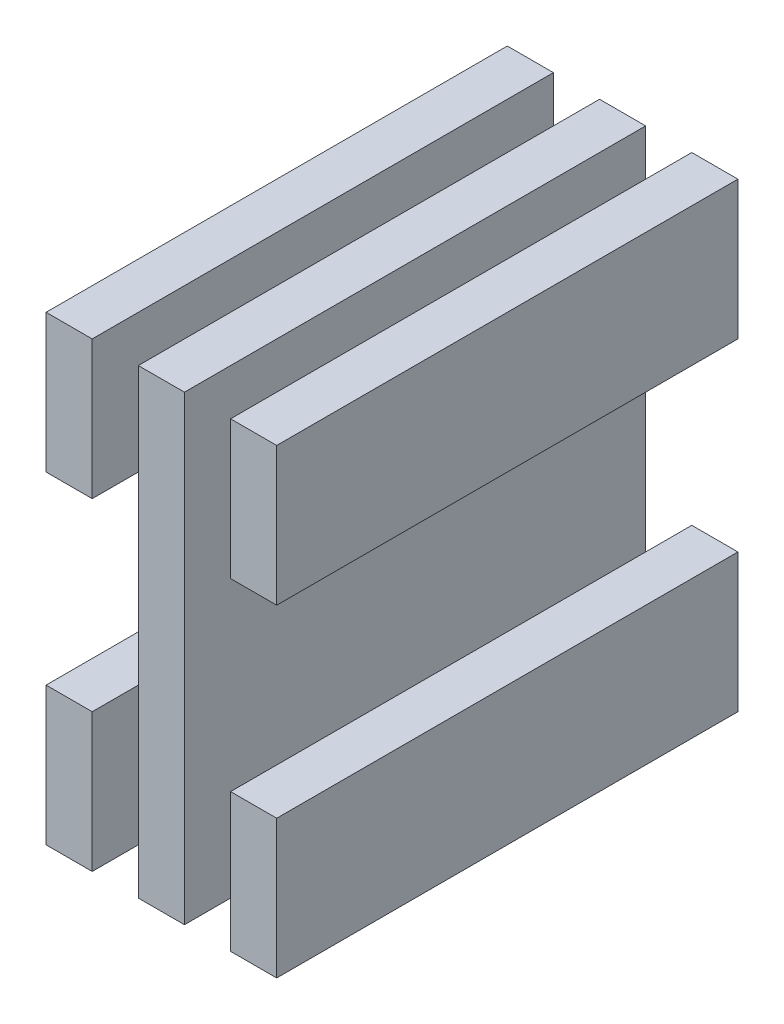
ISO-10303-21;
HEADER;
FILE_DESCRIPTION(('STEP AP214'),'2;1');
FILE_NAME('part.step','',(''),(''),'','','');
FILE_SCHEMA(('AUTOMOTIVE_DESIGN { 1 0 10303 214 1 1 1 1 }'));
ENDSEC;
DATA;
#1=APPLICATION_CONTEXT('core data for automotive mechanical design processes');
#2=APPLICATION_PROTOCOL_DEFINITION('international standard','automotive_design',2000,#1);
#3=PRODUCT_CONTEXT('',#1,'mechanical');
#4=PRODUCT('Part','Part','',(#3));
#5=PRODUCT_RELATED_PRODUCT_CATEGORY('part','',(#4));
#6=PRODUCT_DEFINITION_FORMATION('','',#4);
#7=PRODUCT_DEFINITION_CONTEXT('part definition',#1,'design');
#8=PRODUCT_DEFINITION('design','',#6,#7);
#9=PRODUCT_DEFINITION_SHAPE('','',#8);
#10=(LENGTH_UNIT() NAMED_UNIT(*) SI_UNIT(.MILLI.,.METRE.));
#11=(NAMED_UNIT(*) PLANE_ANGLE_UNIT() SI_UNIT($,.RADIAN.));
#12=(NAMED_UNIT(*) SI_UNIT($,.STERADIAN.) SOLID_ANGLE_UNIT());
#13=UNCERTAINTY_MEASURE_WITH_UNIT(LENGTH_MEASURE(1.E-05),#10,'distance_accuracy_value','');
#14=(GEOMETRIC_REPRESENTATION_CONTEXT(3) GLOBAL_UNCERTAINTY_ASSIGNED_CONTEXT((#13)) GLOBAL_UNIT_ASSIGNED_CONTEXT((#10,
#11,#12)) REPRESENTATION_CONTEXT('',''));
#15=CARTESIAN_POINT('',(0.,0.,0.));
#16=DIRECTION('',(0.,0.,1.));
#17=DIRECTION('',(1.,0.,0.));
#18=AXIS2_PLACEMENT_3D('',#15,#16,#17);
#19=CARTESIAN_POINT('',(0.,50.,0.));
#20=DIRECTION('',(1.,0.,0.));
#21=DIRECTION('',(0.,0.,-1.));
#22=AXIS2_PLACEMENT_3D('',#19,#20,#21);
#23=PLANE('',#22);
#24=DIRECTION('',(0.,-1.,0.));
#25=VECTOR('',#24,1.);
#26=CARTESIAN_POINT('',(0.,50.,-50.));
#27=LINE('',#26,#25);
#28=CARTESIAN_POINT('',(0.,50.,-50.));
#29=VERTEX_POINT('',#28);
#30=CARTESIAN_POINT('',(0.,35.,-50.));
#31=VERTEX_POINT('',#30);
#32=EDGE_CURVE('E47',#29,#31,#27,.T.);
#33=ORIENTED_EDGE('',*,*,#32,.T.);
#34=DIRECTION('',(0.,0.,1.));
#35=VECTOR('',#34,1.);
#36=CARTESIAN_POINT('',(0.,35.,0.));
#37=LINE('',#36,#35);
#38=CARTESIAN_POINT('',(0.,35.,0.));
#39=VERTEX_POINT('',#38);
#40=EDGE_CURVE('E79',#31,#39,#37,.T.);
#41=ORIENTED_EDGE('',*,*,#40,.T.);
#42=DIRECTION('',(0.,-1.,0.));
#43=VECTOR('',#42,1.);
#44=CARTESIAN_POINT('',(0.,50.,0.));
#45=LINE('',#44,#43);
#46=CARTESIAN_POINT('',(0.,50.,0.));
#47=VERTEX_POINT('',#46);
#48=EDGE_CURVE('E88',#47,#39,#45,.T.);
#49=ORIENTED_EDGE('',*,*,#48,.F.);
#50=DIRECTION('',(0.,0.,1.));
#51=VECTOR('',#50,1.);
#52=CARTESIAN_POINT('',(0.,50.,0.));
#53=LINE('',#52,#51);
#54=EDGE_CURVE('E103',#29,#47,#53,.T.);
#55=ORIENTED_EDGE('',*,*,#54,.F.);
#56=EDGE_LOOP('',(#33,#41,#49,#55));
#57=FACE_BOUND('',#56,.T.);
#58=ADVANCED_FACE('F44',(#57),#23,.F.);
#59=CARTESIAN_POINT('',(0.,50.,0.));
#60=DIRECTION('',(0.,0.,-1.));
#61=DIRECTION('',(-1.,0.,0.));
#62=AXIS2_PLACEMENT_3D('',#59,#60,#61);
#63=PLANE('',#62);
#64=ORIENTED_EDGE('',*,*,#48,.T.);
#65=DIRECTION('',(1.,0.,0.));
#66=VECTOR('',#65,1.);
#67=CARTESIAN_POINT('',(0.,35.,0.));
#68=LINE('',#67,#66);
#69=CARTESIAN_POINT('',(5.,35.,0.));
#70=VERTEX_POINT('',#69);
#71=EDGE_CURVE('E81',#39,#70,#68,.T.);
#72=ORIENTED_EDGE('',*,*,#71,.T.);
#73=DIRECTION('',(0.,-1.,0.));
#74=VECTOR('',#73,1.);
#75=CARTESIAN_POINT('',(5.,50.,0.));
#76=LINE('',#75,#74);
#77=CARTESIAN_POINT('',(5.,50.,0.));
#78=VERTEX_POINT('',#77);
#79=EDGE_CURVE('E87',#78,#70,#76,.T.);
#80=ORIENTED_EDGE('',*,*,#79,.F.);
#81=DIRECTION('',(1.,0.,0.));
#82=VECTOR('',#81,1.);
#83=CARTESIAN_POINT('',(0.,50.,0.));
#84=LINE('',#83,#82);
#85=EDGE_CURVE('E97',#47,#78,#84,.T.);
#86=ORIENTED_EDGE('',*,*,#85,.F.);
#87=EDGE_LOOP('',(#64,#72,#80,#86));
#88=FACE_BOUND('',#87,.T.);
#89=ADVANCED_FACE('F96',(#88),#63,.F.);
#90=CARTESIAN_POINT('',(5.,50.,0.));
#91=DIRECTION('',(-1.,0.,0.));
#92=DIRECTION('',(0.,0.,1.));
#93=AXIS2_PLACEMENT_3D('',#90,#91,#92);
#94=PLANE('',#93);
#95=ORIENTED_EDGE('',*,*,#79,.T.);
#96=DIRECTION('',(0.,0.,-1.));
#97=VECTOR('',#96,1.);
#98=CARTESIAN_POINT('',(5.,35.,0.));
#99=LINE('',#98,#97);
#100=CARTESIAN_POINT('',(5.,35.,-50.));
#101=VERTEX_POINT('',#100);
#102=EDGE_CURVE('E61',#70,#101,#99,.T.);
#103=ORIENTED_EDGE('',*,*,#102,.T.);
#104=DIRECTION('',(0.,-1.,0.));
#105=VECTOR('',#104,1.);
#106=CARTESIAN_POINT('',(5.,50.,-50.));
#107=LINE('',#106,#105);
#108=CARTESIAN_POINT('',(5.,50.,-50.));
#109=VERTEX_POINT('',#108);
#110=EDGE_CURVE('E101',#109,#101,#107,.T.);
#111=ORIENTED_EDGE('',*,*,#110,.F.);
#112=DIRECTION('',(0.,0.,-1.));
#113=VECTOR('',#112,1.);
#114=CARTESIAN_POINT('',(5.,50.,0.));
#115=LINE('',#114,#113);
#116=EDGE_CURVE('E112',#78,#109,#115,.T.);
#117=ORIENTED_EDGE('',*,*,#116,.F.);
#118=EDGE_LOOP('',(#95,#103,#111,#117));
#119=FACE_BOUND('',#118,.T.);
#120=ADVANCED_FACE('F119',(#119),#94,.F.);
#121=CARTESIAN_POINT('',(0.,50.,-50.));
#122=DIRECTION('',(0.,0.,1.));
#123=DIRECTION('',(1.,0.,0.));
#124=AXIS2_PLACEMENT_3D('',#121,#122,#123);
#125=PLANE('',#124);
#126=ORIENTED_EDGE('',*,*,#110,.T.);
#127=DIRECTION('',(1.,0.,0.));
#128=VECTOR('',#127,1.);
#129=CARTESIAN_POINT('',(0.,35.,-50.));
#130=LINE('',#129,#128);
#131=EDGE_CURVE('E12',#31,#101,#130,.T.);
#132=ORIENTED_EDGE('',*,*,#131,.F.);
#133=ORIENTED_EDGE('',*,*,#32,.F.);
#134=DIRECTION('',(-1.,0.,0.));
#135=VECTOR('',#134,1.);
#136=CARTESIAN_POINT('',(0.,50.,-50.));
#137=LINE('',#136,#135);
#138=EDGE_CURVE('E53',#109,#29,#137,.T.);
#139=ORIENTED_EDGE('',*,*,#138,.F.);
#140=EDGE_LOOP('',(#126,#132,#133,#139));
#141=FACE_BOUND('',#140,.T.);
#142=ADVANCED_FACE('F117',(#141),#125,.F.);
#143=CARTESIAN_POINT('',(0.,50.,0.));
#144=DIRECTION('',(0.,-1.,0.));
#145=DIRECTION('',(0.,0.,-1.));
#146=AXIS2_PLACEMENT_3D('',#143,#144,#145);
#147=PLANE('',#146);
#148=ORIENTED_EDGE('',*,*,#54,.T.);
#149=ORIENTED_EDGE('',*,*,#85,.T.);
#150=ORIENTED_EDGE('',*,*,#116,.T.);
#151=ORIENTED_EDGE('',*,*,#138,.T.);
#152=EDGE_LOOP('',(#148,#149,#150,#151));
#153=FACE_BOUND('',#152,.T.);
#154=ADVANCED_FACE('F115',(#153),#147,.F.);
#155=CARTESIAN_POINT('',(0.,35.,0.));
#156=DIRECTION('',(0.,1.,0.));
#157=DIRECTION('',(0.,0.,1.));
#158=AXIS2_PLACEMENT_3D('',#155,#156,#157);
#159=PLANE('',#158);
#160=ORIENTED_EDGE('',*,*,#71,.F.);
#161=ORIENTED_EDGE('',*,*,#40,.F.);
#162=ORIENTED_EDGE('',*,*,#131,.T.);
#163=ORIENTED_EDGE('',*,*,#102,.F.);
#164=EDGE_LOOP('',(#160,#161,#162,#163));
#165=FACE_BOUND('',#164,.T.);
#166=ADVANCED_FACE('F82',(#165),#159,.F.);
#167=CLOSED_SHELL('',(#58,#89,#120,#142,#154,#166));
#168=MANIFOLD_SOLID_BREP('B2',#167);
#169=CARTESIAN_POINT('',(20.,50.,0.));
#170=DIRECTION('',(0.,0.,-1.));
#171=DIRECTION('',(-1.,0.,0.));
#172=AXIS2_PLACEMENT_3D('',#169,#170,#171);
#173=PLANE('',#172);
#174=DIRECTION('',(0.,-1.,0.));
#175=VECTOR('',#174,1.);
#176=CARTESIAN_POINT('',(20.,50.,0.));
#177=LINE('',#176,#175);
#178=CARTESIAN_POINT('',(20.,50.,0.));
#179=VERTEX_POINT('',#178);
#180=CARTESIAN_POINT('',(20.,35.,0.));
#181=VERTEX_POINT('',#180);
#182=EDGE_CURVE('E181',#179,#181,#177,.T.);
#183=ORIENTED_EDGE('',*,*,#182,.T.);
#184=DIRECTION('',(1.,0.,0.));
#185=VECTOR('',#184,1.);
#186=CARTESIAN_POINT('',(0.,35.,0.));
#187=LINE('',#186,#185);
#188=CARTESIAN_POINT('',(25.,35.,0.));
#189=VERTEX_POINT('',#188);
#190=EDGE_CURVE('E237',#181,#189,#187,.T.);
#191=ORIENTED_EDGE('',*,*,#190,.T.);
#192=DIRECTION('',(0.,-1.,0.));
#193=VECTOR('',#192,1.);
#194=CARTESIAN_POINT('',(25.,50.,0.));
#195=LINE('',#194,#193);
#196=CARTESIAN_POINT('',(25.,50.,0.));
#197=VERTEX_POINT('',#196);
#198=EDGE_CURVE('E225',#197,#189,#195,.T.);
#199=ORIENTED_EDGE('',*,*,#198,.F.);
#200=DIRECTION('',(1.,0.,0.));
#201=VECTOR('',#200,1.);
#202=CARTESIAN_POINT('',(20.,50.,0.));
#203=LINE('',#202,#201);
#204=EDGE_CURVE('E230',#179,#197,#203,.T.);
#205=ORIENTED_EDGE('',*,*,#204,.F.);
#206=EDGE_LOOP('',(#183,#191,#199,#205));
#207=FACE_BOUND('',#206,.T.);
#208=ADVANCED_FACE('F178',(#207),#173,.F.);
#209=CARTESIAN_POINT('',(25.,50.,0.));
#210=DIRECTION('',(-1.,0.,0.));
#211=DIRECTION('',(0.,0.,1.));
#212=AXIS2_PLACEMENT_3D('',#209,#210,#211);
#213=PLANE('',#212);
#214=ORIENTED_EDGE('',*,*,#198,.T.);
#215=DIRECTION('',(0.,0.,1.));
#216=VECTOR('',#215,1.);
#217=CARTESIAN_POINT('',(25.,35.,0.));
#218=LINE('',#217,#216);
#219=CARTESIAN_POINT('',(25.,35.,-50.));
#220=VERTEX_POINT('',#219);
#221=EDGE_CURVE('E42',#220,#189,#218,.T.);
#222=ORIENTED_EDGE('',*,*,#221,.F.);
#223=DIRECTION('',(0.,-1.,0.));
#224=VECTOR('',#223,1.);
#225=CARTESIAN_POINT('',(25.,50.,-50.));
#226=LINE('',#225,#224);
#227=CARTESIAN_POINT('',(25.,50.,-50.));
#228=VERTEX_POINT('',#227);
#229=EDGE_CURVE('E227',#228,#220,#226,.T.);
#230=ORIENTED_EDGE('',*,*,#229,.F.);
#231=DIRECTION('',(0.,0.,-1.));
#232=VECTOR('',#231,1.);
#233=CARTESIAN_POINT('',(25.,50.,0.));
#234=LINE('',#233,#232);
#235=EDGE_CURVE('E219',#197,#228,#234,.T.);
#236=ORIENTED_EDGE('',*,*,#235,.F.);
#237=EDGE_LOOP('',(#214,#222,#230,#236));
#238=FACE_BOUND('',#237,.T.);
#239=ADVANCED_FACE('F223',(#238),#213,.F.);
#240=CARTESIAN_POINT('',(20.,50.,-50.));
#241=DIRECTION('',(0.,0.,1.));
#242=DIRECTION('',(1.,0.,0.));
#243=AXIS2_PLACEMENT_3D('',#240,#241,#242);
#244=PLANE('',#243);
#245=ORIENTED_EDGE('',*,*,#229,.T.);
#246=DIRECTION('',(1.,0.,0.));
#247=VECTOR('',#246,1.);
#248=CARTESIAN_POINT('',(0.,35.,-50.));
#249=LINE('',#248,#247);
#250=CARTESIAN_POINT('',(20.,35.,-50.));
#251=VERTEX_POINT('',#250);
#252=EDGE_CURVE('E187',#251,#220,#249,.T.);
#253=ORIENTED_EDGE('',*,*,#252,.F.);
#254=DIRECTION('',(0.,-1.,0.));
#255=VECTOR('',#254,1.);
#256=CARTESIAN_POINT('',(20.,50.,-50.));
#257=LINE('',#256,#255);
#258=CARTESIAN_POINT('',(20.,50.,-50.));
#259=VERTEX_POINT('',#258);
#260=EDGE_CURVE('E239',#259,#251,#257,.T.);
#261=ORIENTED_EDGE('',*,*,#260,.F.);
#262=DIRECTION('',(-1.,0.,0.));
#263=VECTOR('',#262,1.);
#264=CARTESIAN_POINT('',(20.,50.,-50.));
#265=LINE('',#264,#263);
#266=EDGE_CURVE('E229',#228,#259,#265,.T.);
#267=ORIENTED_EDGE('',*,*,#266,.F.);
#268=EDGE_LOOP('',(#245,#253,#261,#267));
#269=FACE_BOUND('',#268,.T.);
#270=ADVANCED_FACE('F250',(#269),#244,.F.);
#271=CARTESIAN_POINT('',(20.,50.,0.));
#272=DIRECTION('',(1.,0.,0.));
#273=DIRECTION('',(0.,0.,-1.));
#274=AXIS2_PLACEMENT_3D('',#271,#272,#273);
#275=PLANE('',#274);
#276=ORIENTED_EDGE('',*,*,#260,.T.);
#277=DIRECTION('',(0.,0.,1.));
#278=VECTOR('',#277,1.);
#279=CARTESIAN_POINT('',(20.,35.,0.));
#280=LINE('',#279,#278);
#281=EDGE_CURVE('E196',#251,#181,#280,.T.);
#282=ORIENTED_EDGE('',*,*,#281,.T.);
#283=ORIENTED_EDGE('',*,*,#182,.F.);
#284=DIRECTION('',(0.,0.,1.));
#285=VECTOR('',#284,1.);
#286=CARTESIAN_POINT('',(20.,50.,0.));
#287=LINE('',#286,#285);
#288=EDGE_CURVE('E213',#259,#179,#287,.T.);
#289=ORIENTED_EDGE('',*,*,#288,.F.);
#290=EDGE_LOOP('',(#276,#282,#283,#289));
#291=FACE_BOUND('',#290,.T.);
#292=ADVANCED_FACE('F251',(#291),#275,.F.);
#293=CARTESIAN_POINT('',(0.,50.,0.));
#294=DIRECTION('',(0.,1.,0.));
#295=DIRECTION('',(0.,0.,1.));
#296=AXIS2_PLACEMENT_3D('',#293,#294,#295);
#297=PLANE('',#296);
#298=ORIENTED_EDGE('',*,*,#204,.T.);
#299=ORIENTED_EDGE('',*,*,#235,.T.);
#300=ORIENTED_EDGE('',*,*,#266,.T.);
#301=ORIENTED_EDGE('',*,*,#288,.T.);
#302=EDGE_LOOP('',(#298,#299,#300,#301));
#303=FACE_BOUND('',#302,.T.);
#304=ADVANCED_FACE('F233',(#303),#297,.T.);
#305=CARTESIAN_POINT('',(0.,35.,0.));
#306=DIRECTION('',(0.,1.,0.));
#307=DIRECTION('',(0.,0.,1.));
#308=AXIS2_PLACEMENT_3D('',#305,#306,#307);
#309=PLANE('',#308);
#310=ORIENTED_EDGE('',*,*,#252,.T.);
#311=ORIENTED_EDGE('',*,*,#221,.T.);
#312=ORIENTED_EDGE('',*,*,#190,.F.);
#313=ORIENTED_EDGE('',*,*,#281,.F.);
#314=EDGE_LOOP('',(#310,#311,#312,#313));
#315=FACE_BOUND('',#314,.T.);
#316=ADVANCED_FACE('F258',(#315),#309,.F.);
#317=CLOSED_SHELL('',(#208,#239,#270,#292,#304,#316));
#318=MANIFOLD_SOLID_BREP('B6',#317);
#319=CARTESIAN_POINT('',(0.,0.,0.));
#320=DIRECTION('',(0.,1.,0.));
#321=DIRECTION('',(0.,0.,1.));
#322=AXIS2_PLACEMENT_3D('',#319,#320,#321);
#323=PLANE('',#322);
#324=DIRECTION('',(1.,0.,0.));
#325=VECTOR('',#324,1.);
#326=CARTESIAN_POINT('',(20.,0.,0.));
#327=LINE('',#326,#325);
#328=CARTESIAN_POINT('',(20.,0.,0.));
#329=VERTEX_POINT('',#328);
#330=CARTESIAN_POINT('',(25.,0.,0.));
#331=VERTEX_POINT('',#330);
#332=EDGE_CURVE('E365',#329,#331,#327,.T.);
#333=ORIENTED_EDGE('',*,*,#332,.F.);
#334=DIRECTION('',(0.,0.,1.));
#335=VECTOR('',#334,1.);
#336=CARTESIAN_POINT('',(20.,0.,0.));
#337=LINE('',#336,#335);
#338=CARTESIAN_POINT('',(20.,0.,-50.));
#339=VERTEX_POINT('',#338);
#340=EDGE_CURVE('E371',#339,#329,#337,.T.);
#341=ORIENTED_EDGE('',*,*,#340,.F.);
#342=DIRECTION('',(-1.,0.,0.));
#343=VECTOR('',#342,1.);
#344=CARTESIAN_POINT('',(20.,0.,-50.));
#345=LINE('',#344,#343);
#346=CARTESIAN_POINT('',(25.,0.,-50.));
#347=VERTEX_POINT('',#346);
#348=EDGE_CURVE('E373',#347,#339,#345,.T.);
#349=ORIENTED_EDGE('',*,*,#348,.F.);
#350=DIRECTION('',(0.,0.,-1.));
#351=VECTOR('',#350,1.);
#352=CARTESIAN_POINT('',(25.,0.,0.));
#353=LINE('',#352,#351);
#354=EDGE_CURVE('E376',#331,#347,#353,.T.);
#355=ORIENTED_EDGE('',*,*,#354,.F.);
#356=EDGE_LOOP('',(#333,#341,#349,#355));
#357=FACE_BOUND('',#356,.T.);
#358=ADVANCED_FACE('F312',(#357),#323,.F.);
#359=CARTESIAN_POINT('',(20.,50.,0.));
#360=DIRECTION('',(1.,0.,0.));
#361=DIRECTION('',(0.,0.,-1.));
#362=AXIS2_PLACEMENT_3D('',#359,#360,#361);
#363=PLANE('',#362);
#364=DIRECTION('',(0.,-1.,0.));
#365=VECTOR('',#364,1.);
#366=CARTESIAN_POINT('',(20.,50.,0.));
#367=LINE('',#366,#365);
#368=CARTESIAN_POINT('',(20.,15.,0.));
#369=VERTEX_POINT('',#368);
#370=EDGE_CURVE('E334',#369,#329,#367,.T.);
#371=ORIENTED_EDGE('',*,*,#370,.F.);
#372=DIRECTION('',(0.,0.,-1.));
#373=VECTOR('',#372,1.);
#374=CARTESIAN_POINT('',(20.,15.,0.));
#375=LINE('',#374,#373);
#376=CARTESIAN_POINT('',(20.,15.,-50.));
#377=VERTEX_POINT('',#376);
#378=EDGE_CURVE('E176',#369,#377,#375,.T.);
#379=ORIENTED_EDGE('',*,*,#378,.T.);
#380=DIRECTION('',(0.,-1.,0.));
#381=VECTOR('',#380,1.);
#382=CARTESIAN_POINT('',(20.,50.,-50.));
#383=LINE('',#382,#381);
#384=EDGE_CURVE('E366',#377,#339,#383,.T.);
#385=ORIENTED_EDGE('',*,*,#384,.T.);
#386=ORIENTED_EDGE('',*,*,#340,.T.);
#387=EDGE_LOOP('',(#371,#379,#385,#386));
#388=FACE_BOUND('',#387,.T.);
#389=ADVANCED_FACE('F385',(#388),#363,.F.);
#390=CARTESIAN_POINT('',(20.,50.,-50.));
#391=DIRECTION('',(0.,0.,1.));
#392=DIRECTION('',(1.,0.,0.));
#393=AXIS2_PLACEMENT_3D('',#390,#391,#392);
#394=PLANE('',#393);
#395=ORIENTED_EDGE('',*,*,#384,.F.);
#396=DIRECTION('',(1.,0.,0.));
#397=VECTOR('',#396,1.);
#398=CARTESIAN_POINT('',(0.,15.,-50.));
#399=LINE('',#398,#397);
#400=CARTESIAN_POINT('',(25.,15.,-50.));
#401=VERTEX_POINT('',#400);
#402=EDGE_CURVE('E327',#377,#401,#399,.T.);
#403=ORIENTED_EDGE('',*,*,#402,.T.);
#404=DIRECTION('',(0.,-1.,0.));
#405=VECTOR('',#404,1.);
#406=CARTESIAN_POINT('',(25.,50.,-50.));
#407=LINE('',#406,#405);
#408=EDGE_CURVE('E362',#401,#347,#407,.T.);
#409=ORIENTED_EDGE('',*,*,#408,.T.);
#410=ORIENTED_EDGE('',*,*,#348,.T.);
#411=EDGE_LOOP('',(#395,#403,#409,#410));
#412=FACE_BOUND('',#411,.T.);
#413=ADVANCED_FACE('F381',(#412),#394,.F.);
#414=CARTESIAN_POINT('',(25.,50.,0.));
#415=DIRECTION('',(-1.,0.,0.));
#416=DIRECTION('',(0.,0.,1.));
#417=AXIS2_PLACEMENT_3D('',#414,#415,#416);
#418=PLANE('',#417);
#419=ORIENTED_EDGE('',*,*,#408,.F.);
#420=DIRECTION('',(0.,0.,-1.));
#421=VECTOR('',#420,1.);
#422=CARTESIAN_POINT('',(25.,15.,0.));
#423=LINE('',#422,#421);
#424=CARTESIAN_POINT('',(25.,15.,0.));
#425=VERTEX_POINT('',#424);
#426=EDGE_CURVE('E354',#425,#401,#423,.T.);
#427=ORIENTED_EDGE('',*,*,#426,.F.);
#428=DIRECTION('',(0.,-1.,0.));
#429=VECTOR('',#428,1.);
#430=CARTESIAN_POINT('',(25.,50.,0.));
#431=LINE('',#430,#429);
#432=EDGE_CURVE('E320',#425,#331,#431,.T.);
#433=ORIENTED_EDGE('',*,*,#432,.T.);
#434=ORIENTED_EDGE('',*,*,#354,.T.);
#435=EDGE_LOOP('',(#419,#427,#433,#434));
#436=FACE_BOUND('',#435,.T.);
#437=ADVANCED_FACE('F359',(#436),#418,.F.);
#438=CARTESIAN_POINT('',(20.,50.,0.));
#439=DIRECTION('',(0.,0.,-1.));
#440=DIRECTION('',(-1.,0.,0.));
#441=AXIS2_PLACEMENT_3D('',#438,#439,#440);
#442=PLANE('',#441);
#443=ORIENTED_EDGE('',*,*,#432,.F.);
#444=DIRECTION('',(1.,0.,0.));
#445=VECTOR('',#444,1.);
#446=CARTESIAN_POINT('',(0.,15.,0.));
#447=LINE('',#446,#445);
#448=EDGE_CURVE('E351',#369,#425,#447,.T.);
#449=ORIENTED_EDGE('',*,*,#448,.F.);
#450=ORIENTED_EDGE('',*,*,#370,.T.);
#451=ORIENTED_EDGE('',*,*,#332,.T.);
#452=EDGE_LOOP('',(#443,#449,#450,#451));
#453=FACE_BOUND('',#452,.T.);
#454=ADVANCED_FACE('F314',(#453),#442,.F.);
#455=CARTESIAN_POINT('',(0.,15.,0.));
#456=DIRECTION('',(0.,-1.,0.));
#457=DIRECTION('',(0.,0.,-1.));
#458=AXIS2_PLACEMENT_3D('',#455,#456,#457);
#459=PLANE('',#458);
#460=ORIENTED_EDGE('',*,*,#448,.T.);
#461=ORIENTED_EDGE('',*,*,#426,.T.);
#462=ORIENTED_EDGE('',*,*,#402,.F.);
#463=ORIENTED_EDGE('',*,*,#378,.F.);
#464=EDGE_LOOP('',(#460,#461,#462,#463));
#465=FACE_BOUND('',#464,.T.);
#466=ADVANCED_FACE('F353',(#465),#459,.F.);
#467=CLOSED_SHELL('',(#358,#389,#413,#437,#454,#466));
#468=MANIFOLD_SOLID_BREP('B36',#467);
#469=CARTESIAN_POINT('',(10.,50.,0.));
#470=DIRECTION('',(0.,0.,-1.));
#471=DIRECTION('',(-1.,0.,0.));
#472=AXIS2_PLACEMENT_3D('',#469,#470,#471);
#473=PLANE('',#472);
#474=DIRECTION('',(1.,0.,0.));
#475=VECTOR('',#474,1.);
#476=CARTESIAN_POINT('',(10.,0.,0.));
#477=LINE('',#476,#475);
#478=CARTESIAN_POINT('',(10.,0.,0.));
#479=VERTEX_POINT('',#478);
#480=CARTESIAN_POINT('',(15.,0.,0.));
#481=VERTEX_POINT('',#480);
#482=EDGE_CURVE('E508',#479,#481,#477,.T.);
#483=ORIENTED_EDGE('',*,*,#482,.T.);
#484=DIRECTION('',(0.,-1.,0.));
#485=VECTOR('',#484,1.);
#486=CARTESIAN_POINT('',(15.,50.,0.));
#487=LINE('',#486,#485);
#488=CARTESIAN_POINT('',(15.,50.,0.));
#489=VERTEX_POINT('',#488);
#490=EDGE_CURVE('E310',#489,#481,#487,.T.);
#491=ORIENTED_EDGE('',*,*,#490,.F.);
#492=DIRECTION('',(1.,0.,0.));
#493=VECTOR('',#492,1.);
#494=CARTESIAN_POINT('',(10.,50.,0.));
#495=LINE('',#494,#493);
#496=CARTESIAN_POINT('',(10.,50.,0.));
#497=VERTEX_POINT('',#496);
#498=EDGE_CURVE('E496',#497,#489,#495,.T.);
#499=ORIENTED_EDGE('',*,*,#498,.F.);
#500=DIRECTION('',(0.,-1.,0.));
#501=VECTOR('',#500,1.);
#502=CARTESIAN_POINT('',(10.,50.,0.));
#503=LINE('',#502,#501);
#504=EDGE_CURVE('E504',#497,#479,#503,.T.);
#505=ORIENTED_EDGE('',*,*,#504,.T.);
#506=EDGE_LOOP('',(#483,#491,#499,#505));
#507=FACE_BOUND('',#506,.T.);
#508=ADVANCED_FACE('F445',(#507),#473,.F.);
#509=CARTESIAN_POINT('',(15.,50.,0.));
#510=DIRECTION('',(-1.,0.,0.));
#511=DIRECTION('',(0.,0.,1.));
#512=AXIS2_PLACEMENT_3D('',#509,#510,#511);
#513=PLANE('',#512);
#514=DIRECTION('',(0.,0.,-1.));
#515=VECTOR('',#514,1.);
#516=CARTESIAN_POINT('',(15.,0.,0.));
#517=LINE('',#516,#515);
#518=CARTESIAN_POINT('',(15.,0.,-50.));
#519=VERTEX_POINT('',#518);
#520=EDGE_CURVE('E500',#481,#519,#517,.T.);
#521=ORIENTED_EDGE('',*,*,#520,.T.);
#522=DIRECTION('',(0.,-1.,0.));
#523=VECTOR('',#522,1.);
#524=CARTESIAN_POINT('',(15.,50.,-50.));
#525=LINE('',#524,#523);
#526=CARTESIAN_POINT('',(15.,50.,-50.));
#527=VERTEX_POINT('',#526);
#528=EDGE_CURVE('E453',#527,#519,#525,.T.);
#529=ORIENTED_EDGE('',*,*,#528,.F.);
#530=DIRECTION('',(0.,0.,-1.));
#531=VECTOR('',#530,1.);
#532=CARTESIAN_POINT('',(15.,50.,0.));
#533=LINE('',#532,#531);
#534=EDGE_CURVE('E491',#489,#527,#533,.T.);
#535=ORIENTED_EDGE('',*,*,#534,.F.);
#536=ORIENTED_EDGE('',*,*,#490,.T.);
#537=EDGE_LOOP('',(#521,#529,#535,#536));
#538=FACE_BOUND('',#537,.T.);
#539=ADVANCED_FACE('F499',(#538),#513,.F.);
#540=CARTESIAN_POINT('',(10.,50.,-50.));
#541=DIRECTION('',(0.,0.,1.));
#542=DIRECTION('',(1.,0.,0.));
#543=AXIS2_PLACEMENT_3D('',#540,#541,#542);
#544=PLANE('',#543);
#545=DIRECTION('',(-1.,0.,0.));
#546=VECTOR('',#545,1.);
#547=CARTESIAN_POINT('',(10.,0.,-50.));
#548=LINE('',#547,#546);
#549=CARTESIAN_POINT('',(10.,0.,-50.));
#550=VERTEX_POINT('',#549);
#551=EDGE_CURVE('E478',#519,#550,#548,.T.);
#552=ORIENTED_EDGE('',*,*,#551,.T.);
#553=DIRECTION('',(0.,-1.,0.));
#554=VECTOR('',#553,1.);
#555=CARTESIAN_POINT('',(10.,50.,-50.));
#556=LINE('',#555,#554);
#557=CARTESIAN_POINT('',(10.,50.,-50.));
#558=VERTEX_POINT('',#557);
#559=EDGE_CURVE('E501',#558,#550,#556,.T.);
#560=ORIENTED_EDGE('',*,*,#559,.F.);
#561=DIRECTION('',(-1.,0.,0.));
#562=VECTOR('',#561,1.);
#563=CARTESIAN_POINT('',(10.,50.,-50.));
#564=LINE('',#563,#562);
#565=EDGE_CURVE('E494',#527,#558,#564,.T.);
#566=ORIENTED_EDGE('',*,*,#565,.F.);
#567=ORIENTED_EDGE('',*,*,#528,.T.);
#568=EDGE_LOOP('',(#552,#560,#566,#567));
#569=FACE_BOUND('',#568,.T.);
#570=ADVANCED_FACE('F502',(#569),#544,.F.);
#571=CARTESIAN_POINT('',(10.,50.,0.));
#572=DIRECTION('',(1.,0.,0.));
#573=DIRECTION('',(0.,0.,-1.));
#574=AXIS2_PLACEMENT_3D('',#571,#572,#573);
#575=PLANE('',#574);
#576=DIRECTION('',(0.,0.,1.));
#577=VECTOR('',#576,1.);
#578=CARTESIAN_POINT('',(10.,0.,0.));
#579=LINE('',#578,#577);
#580=EDGE_CURVE('E484',#550,#479,#579,.T.);
#581=ORIENTED_EDGE('',*,*,#580,.T.);
#582=ORIENTED_EDGE('',*,*,#504,.F.);
#583=DIRECTION('',(0.,0.,1.));
#584=VECTOR('',#583,1.);
#585=CARTESIAN_POINT('',(10.,50.,0.));
#586=LINE('',#585,#584);
#587=EDGE_CURVE('E461',#558,#497,#586,.T.);
#588=ORIENTED_EDGE('',*,*,#587,.F.);
#589=ORIENTED_EDGE('',*,*,#559,.T.);
#590=EDGE_LOOP('',(#581,#582,#588,#589));
#591=FACE_BOUND('',#590,.T.);
#592=ADVANCED_FACE('F515',(#591),#575,.F.);
#593=CARTESIAN_POINT('',(0.,50.,0.));
#594=DIRECTION('',(0.,1.,0.));
#595=DIRECTION('',(0.,0.,1.));
#596=AXIS2_PLACEMENT_3D('',#593,#594,#595);
#597=PLANE('',#596);
#598=ORIENTED_EDGE('',*,*,#498,.T.);
#599=ORIENTED_EDGE('',*,*,#534,.T.);
#600=ORIENTED_EDGE('',*,*,#565,.T.);
#601=ORIENTED_EDGE('',*,*,#587,.T.);
#602=EDGE_LOOP('',(#598,#599,#600,#601));
#603=FACE_BOUND('',#602,.T.);
#604=ADVANCED_FACE('F492',(#603),#597,.T.);
#605=CARTESIAN_POINT('',(0.,0.,0.));
#606=DIRECTION('',(0.,1.,0.));
#607=DIRECTION('',(0.,0.,1.));
#608=AXIS2_PLACEMENT_3D('',#605,#606,#607);
#609=PLANE('',#608);
#610=ORIENTED_EDGE('',*,*,#482,.F.);
#611=ORIENTED_EDGE('',*,*,#580,.F.);
#612=ORIENTED_EDGE('',*,*,#551,.F.);
#613=ORIENTED_EDGE('',*,*,#520,.F.);
#614=EDGE_LOOP('',(#610,#611,#612,#613));
#615=FACE_BOUND('',#614,.T.);
#616=ADVANCED_FACE('F518',(#615),#609,.F.);
#617=CLOSED_SHELL('',(#508,#539,#570,#592,#604,#616));
#618=MANIFOLD_SOLID_BREP('B170',#617);
#619=CARTESIAN_POINT('',(0.,0.,0.));
#620=DIRECTION('',(0.,-1.,0.));
#621=DIRECTION('',(0.,0.,-1.));
#622=AXIS2_PLACEMENT_3D('',#619,#620,#621);
#623=PLANE('',#622);
#624=DIRECTION('',(0.,0.,1.));
#625=VECTOR('',#624,1.);
#626=CARTESIAN_POINT('',(0.,0.,0.));
#627=LINE('',#626,#625);
#628=CARTESIAN_POINT('',(0.,0.,-50.));
#629=VERTEX_POINT('',#628);
#630=CARTESIAN_POINT('',(0.,0.,0.));
#631=VERTEX_POINT('',#630);
#632=EDGE_CURVE('E622',#629,#631,#627,.T.);
#633=ORIENTED_EDGE('',*,*,#632,.F.);
#634=DIRECTION('',(-1.,0.,0.));
#635=VECTOR('',#634,1.);
#636=CARTESIAN_POINT('',(0.,0.,-50.));
#637=LINE('',#636,#635);
#638=CARTESIAN_POINT('',(5.,0.,-50.));
#639=VERTEX_POINT('',#638);
#640=EDGE_CURVE('E633',#639,#629,#637,.T.);
#641=ORIENTED_EDGE('',*,*,#640,.F.);
#642=DIRECTION('',(0.,0.,-1.));
#643=VECTOR('',#642,1.);
#644=CARTESIAN_POINT('',(5.,0.,0.));
#645=LINE('',#644,#643);
#646=CARTESIAN_POINT('',(5.,0.,0.));
#647=VERTEX_POINT('',#646);
#648=EDGE_CURVE('E627',#647,#639,#645,.T.);
#649=ORIENTED_EDGE('',*,*,#648,.F.);
#650=DIRECTION('',(1.,0.,0.));
#651=VECTOR('',#650,1.);
#652=CARTESIAN_POINT('',(0.,0.,0.));
#653=LINE('',#652,#651);
#654=EDGE_CURVE('E625',#631,#647,#653,.T.);
#655=ORIENTED_EDGE('',*,*,#654,.F.);
#656=EDGE_LOOP('',(#633,#641,#649,#655));
#657=FACE_BOUND('',#656,.T.);
#658=ADVANCED_FACE('F569',(#657),#623,.T.);
#659=CARTESIAN_POINT('',(0.,50.,-50.));
#660=DIRECTION('',(0.,0.,1.));
#661=DIRECTION('',(1.,0.,0.));
#662=AXIS2_PLACEMENT_3D('',#659,#660,#661);
#663=PLANE('',#662);
#664=DIRECTION('',(0.,-1.,0.));
#665=VECTOR('',#664,1.);
#666=CARTESIAN_POINT('',(0.,50.,-50.));
#667=LINE('',#666,#665);
#668=CARTESIAN_POINT('',(0.,15.,-50.));
#669=VERTEX_POINT('',#668);
#670=EDGE_CURVE('E592',#669,#629,#667,.T.);
#671=ORIENTED_EDGE('',*,*,#670,.F.);
#672=DIRECTION('',(1.,0.,0.));
#673=VECTOR('',#672,1.);
#674=CARTESIAN_POINT('',(0.,15.,-50.));
#675=LINE('',#674,#673);
#676=CARTESIAN_POINT('',(5.,15.,-50.));
#677=VERTEX_POINT('',#676);
#678=EDGE_CURVE('E612',#669,#677,#675,.T.);
#679=ORIENTED_EDGE('',*,*,#678,.T.);
#680=DIRECTION('',(0.,-1.,0.));
#681=VECTOR('',#680,1.);
#682=CARTESIAN_POINT('',(5.,50.,-50.));
#683=LINE('',#682,#681);
#684=EDGE_CURVE('E636',#677,#639,#683,.T.);
#685=ORIENTED_EDGE('',*,*,#684,.T.);
#686=ORIENTED_EDGE('',*,*,#640,.T.);
#687=EDGE_LOOP('',(#671,#679,#685,#686));
#688=FACE_BOUND('',#687,.T.);
#689=ADVANCED_FACE('F642',(#688),#663,.F.);
#690=CARTESIAN_POINT('',(5.,50.,0.));
#691=DIRECTION('',(-1.,0.,0.));
#692=DIRECTION('',(0.,0.,1.));
#693=AXIS2_PLACEMENT_3D('',#690,#691,#692);
#694=PLANE('',#693);
#695=ORIENTED_EDGE('',*,*,#684,.F.);
#696=DIRECTION('',(0.,0.,1.));
#697=VECTOR('',#696,1.);
#698=CARTESIAN_POINT('',(5.,15.,0.));
#699=LINE('',#698,#697);
#700=CARTESIAN_POINT('',(5.,15.,0.));
#701=VERTEX_POINT('',#700);
#702=EDGE_CURVE('E584',#677,#701,#699,.T.);
#703=ORIENTED_EDGE('',*,*,#702,.T.);
#704=DIRECTION('',(0.,-1.,0.));
#705=VECTOR('',#704,1.);
#706=CARTESIAN_POINT('',(5.,50.,0.));
#707=LINE('',#706,#705);
#708=EDGE_CURVE('E577',#701,#647,#707,.T.);
#709=ORIENTED_EDGE('',*,*,#708,.T.);
#710=ORIENTED_EDGE('',*,*,#648,.T.);
#711=EDGE_LOOP('',(#695,#703,#709,#710));
#712=FACE_BOUND('',#711,.T.);
#713=ADVANCED_FACE('F639',(#712),#694,.F.);
#714=CARTESIAN_POINT('',(0.,50.,0.));
#715=DIRECTION('',(0.,0.,-1.));
#716=DIRECTION('',(-1.,0.,0.));
#717=AXIS2_PLACEMENT_3D('',#714,#715,#716);
#718=PLANE('',#717);
#719=ORIENTED_EDGE('',*,*,#708,.F.);
#720=DIRECTION('',(1.,0.,0.));
#721=VECTOR('',#720,1.);
#722=CARTESIAN_POINT('',(0.,15.,0.));
#723=LINE('',#722,#721);
#724=CARTESIAN_POINT('',(0.,15.,0.));
#725=VERTEX_POINT('',#724);
#726=EDGE_CURVE('E611',#725,#701,#723,.T.);
#727=ORIENTED_EDGE('',*,*,#726,.F.);
#728=DIRECTION('',(0.,-1.,0.));
#729=VECTOR('',#728,1.);
#730=CARTESIAN_POINT('',(0.,50.,0.));
#731=LINE('',#730,#729);
#732=EDGE_CURVE('E443',#725,#631,#731,.T.);
#733=ORIENTED_EDGE('',*,*,#732,.T.);
#734=ORIENTED_EDGE('',*,*,#654,.T.);
#735=EDGE_LOOP('',(#719,#727,#733,#734));
#736=FACE_BOUND('',#735,.T.);
#737=ADVANCED_FACE('F617',(#736),#718,.F.);
#738=CARTESIAN_POINT('',(0.,50.,0.));
#739=DIRECTION('',(1.,0.,0.));
#740=DIRECTION('',(0.,0.,-1.));
#741=AXIS2_PLACEMENT_3D('',#738,#739,#740);
#742=PLANE('',#741);
#743=ORIENTED_EDGE('',*,*,#732,.F.);
#744=DIRECTION('',(0.,0.,-1.));
#745=VECTOR('',#744,1.);
#746=CARTESIAN_POINT('',(0.,15.,0.));
#747=LINE('',#746,#745);
#748=EDGE_CURVE('E608',#725,#669,#747,.T.);
#749=ORIENTED_EDGE('',*,*,#748,.T.);
#750=ORIENTED_EDGE('',*,*,#670,.T.);
#751=ORIENTED_EDGE('',*,*,#632,.T.);
#752=EDGE_LOOP('',(#743,#749,#750,#751));
#753=FACE_BOUND('',#752,.T.);
#754=ADVANCED_FACE('F571',(#753),#742,.F.);
#755=CARTESIAN_POINT('',(0.,15.,0.));
#756=DIRECTION('',(0.,-1.,0.));
#757=DIRECTION('',(0.,0.,-1.));
#758=AXIS2_PLACEMENT_3D('',#755,#756,#757);
#759=PLANE('',#758);
#760=ORIENTED_EDGE('',*,*,#678,.F.);
#761=ORIENTED_EDGE('',*,*,#748,.F.);
#762=ORIENTED_EDGE('',*,*,#726,.T.);
#763=ORIENTED_EDGE('',*,*,#702,.F.);
#764=EDGE_LOOP('',(#760,#761,#762,#763));
#765=FACE_BOUND('',#764,.T.);
#766=ADVANCED_FACE('F610',(#765),#759,.F.);
#767=CLOSED_SHELL('',(#658,#689,#713,#737,#754,#766));
#768=MANIFOLD_SOLID_BREP('B304',#767);
#769=ADVANCED_BREP_SHAPE_REPRESENTATION('',(#18,#168,#318,#468,#618,#768),#14);
#770=SHAPE_DEFINITION_REPRESENTATION(#9,#769);
ENDSEC;
END-ISO-10303-21;
